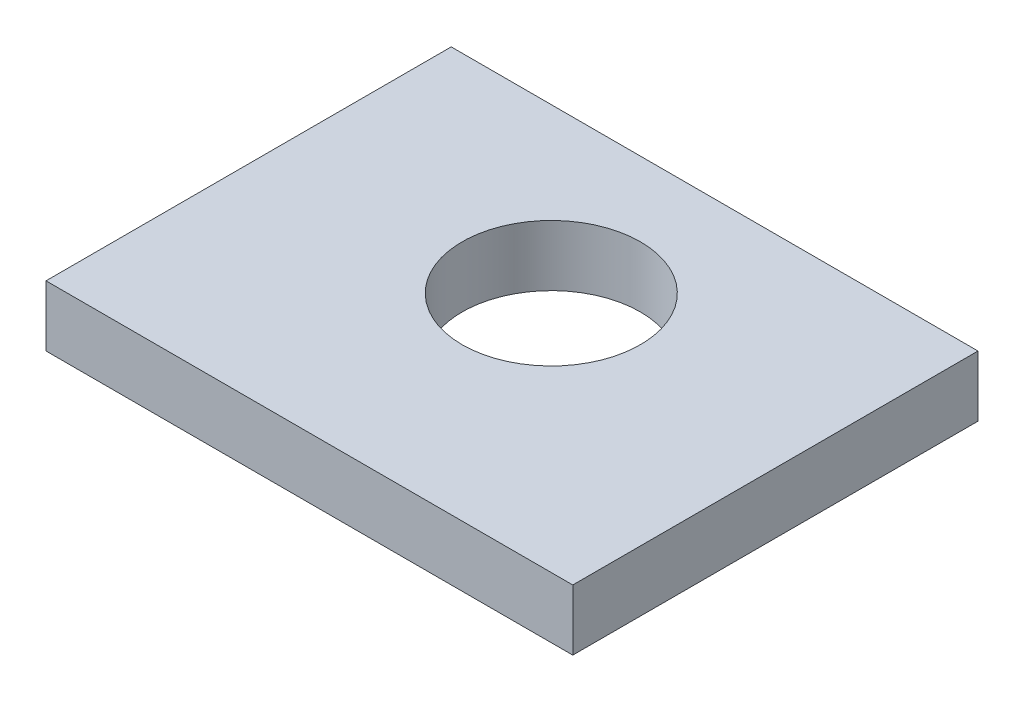
ISO-10303-21;
HEADER;
FILE_DESCRIPTION(('STEP AP214'),'2;1');
FILE_NAME('part.step','',(''),(''),'','','');
FILE_SCHEMA(('AUTOMOTIVE_DESIGN { 1 0 10303 214 1 1 1 1 }'));
ENDSEC;
DATA;
#1=APPLICATION_CONTEXT('core data for automotive mechanical design processes');
#2=APPLICATION_PROTOCOL_DEFINITION('international standard','automotive_design',2000,#1);
#3=PRODUCT_CONTEXT('',#1,'mechanical');
#4=PRODUCT('Part','Part','',(#3));
#5=PRODUCT_RELATED_PRODUCT_CATEGORY('part','',(#4));
#6=PRODUCT_DEFINITION_FORMATION('','',#4);
#7=PRODUCT_DEFINITION_CONTEXT('part definition',#1,'design');
#8=PRODUCT_DEFINITION('design','',#6,#7);
#9=PRODUCT_DEFINITION_SHAPE('','',#8);
#10=(LENGTH_UNIT() NAMED_UNIT(*) SI_UNIT(.MILLI.,.METRE.));
#11=(NAMED_UNIT(*) PLANE_ANGLE_UNIT() SI_UNIT($,.RADIAN.));
#12=(NAMED_UNIT(*) SI_UNIT($,.STERADIAN.) SOLID_ANGLE_UNIT());
#13=UNCERTAINTY_MEASURE_WITH_UNIT(LENGTH_MEASURE(1.E-05),#10,'distance_accuracy_value','');
#14=(GEOMETRIC_REPRESENTATION_CONTEXT(3) GLOBAL_UNCERTAINTY_ASSIGNED_CONTEXT((#13)) GLOBAL_UNIT_ASSIGNED_CONTEXT((#10,
#11,#12)) REPRESENTATION_CONTEXT('',''));
#15=CARTESIAN_POINT('',(0.,0.,0.));
#16=DIRECTION('',(0.,0.,1.));
#17=DIRECTION('',(1.,0.,0.));
#18=AXIS2_PLACEMENT_3D('',#15,#16,#17);
#19=CARTESIAN_POINT('',(3.25,0.75,2.5));
#20=DIRECTION('',(-1.,0.,0.));
#21=DIRECTION('',(0.,0.,1.));
#22=AXIS2_PLACEMENT_3D('',#19,#20,#21);
#23=PLANE('',#22);
#24=DIRECTION('',(0.,0.,-1.));
#25=VECTOR('',#24,1.);
#26=CARTESIAN_POINT('',(3.25,0.,2.5));
#27=LINE('',#26,#25);
#28=CARTESIAN_POINT('',(3.25,0.,2.5));
#29=VERTEX_POINT('',#28);
#30=CARTESIAN_POINT('',(3.25,0.,-2.5));
#31=VERTEX_POINT('',#30);
#32=EDGE_CURVE('E96',#29,#31,#27,.T.);
#33=ORIENTED_EDGE('',*,*,#32,.T.);
#34=DIRECTION('',(0.,-1.,0.));
#35=VECTOR('',#34,1.);
#36=CARTESIAN_POINT('',(3.25,0.75,-2.5));
#37=LINE('',#36,#35);
#38=CARTESIAN_POINT('',(3.25,0.75,-2.5));
#39=VERTEX_POINT('',#38);
#40=EDGE_CURVE('E11',#39,#31,#37,.T.);
#41=ORIENTED_EDGE('',*,*,#40,.F.);
#42=DIRECTION('',(0.,0.,-1.));
#43=VECTOR('',#42,1.);
#44=CARTESIAN_POINT('',(3.25,0.75,2.5));
#45=LINE('',#44,#43);
#46=CARTESIAN_POINT('',(3.25,0.75,2.5));
#47=VERTEX_POINT('',#46);
#48=EDGE_CURVE('E84',#47,#39,#45,.T.);
#49=ORIENTED_EDGE('',*,*,#48,.F.);
#50=DIRECTION('',(0.,-1.,0.));
#51=VECTOR('',#50,1.);
#52=CARTESIAN_POINT('',(3.25,0.75,2.5));
#53=LINE('',#52,#51);
#54=EDGE_CURVE('E92',#47,#29,#53,.T.);
#55=ORIENTED_EDGE('',*,*,#54,.T.);
#56=EDGE_LOOP('',(#33,#41,#49,#55));
#57=FACE_BOUND('',#56,.T.);
#58=ADVANCED_FACE('F33',(#57),#23,.F.);
#59=CARTESIAN_POINT('',(-3.25,0.75,-2.5));
#60=DIRECTION('',(0.,0.,1.));
#61=DIRECTION('',(1.,0.,0.));
#62=AXIS2_PLACEMENT_3D('',#59,#60,#61);
#63=PLANE('',#62);
#64=DIRECTION('',(-1.,0.,0.));
#65=VECTOR('',#64,1.);
#66=CARTESIAN_POINT('',(-3.25,0.,-2.5));
#67=LINE('',#66,#65);
#68=CARTESIAN_POINT('',(-3.25,0.,-2.5));
#69=VERTEX_POINT('',#68);
#70=EDGE_CURVE('E88',#31,#69,#67,.T.);
#71=ORIENTED_EDGE('',*,*,#70,.T.);
#72=DIRECTION('',(0.,-1.,0.));
#73=VECTOR('',#72,1.);
#74=CARTESIAN_POINT('',(-3.25,0.75,-2.5));
#75=LINE('',#74,#73);
#76=CARTESIAN_POINT('',(-3.25,0.75,-2.5));
#77=VERTEX_POINT('',#76);
#78=EDGE_CURVE('E41',#77,#69,#75,.T.);
#79=ORIENTED_EDGE('',*,*,#78,.F.);
#80=DIRECTION('',(-1.,0.,0.));
#81=VECTOR('',#80,1.);
#82=CARTESIAN_POINT('',(-3.25,0.75,-2.5));
#83=LINE('',#82,#81);
#84=EDGE_CURVE('E79',#39,#77,#83,.T.);
#85=ORIENTED_EDGE('',*,*,#84,.F.);
#86=ORIENTED_EDGE('',*,*,#40,.T.);
#87=EDGE_LOOP('',(#71,#79,#85,#86));
#88=FACE_BOUND('',#87,.T.);
#89=ADVANCED_FACE('F87',(#88),#63,.F.);
#90=CARTESIAN_POINT('',(-3.25,0.75,2.5));
#91=DIRECTION('',(1.,0.,0.));
#92=DIRECTION('',(0.,0.,-1.));
#93=AXIS2_PLACEMENT_3D('',#90,#91,#92);
#94=PLANE('',#93);
#95=DIRECTION('',(0.,0.,1.));
#96=VECTOR('',#95,1.);
#97=CARTESIAN_POINT('',(-3.25,0.,2.5));
#98=LINE('',#97,#96);
#99=CARTESIAN_POINT('',(-3.25,0.,2.5));
#100=VERTEX_POINT('',#99);
#101=EDGE_CURVE('E66',#69,#100,#98,.T.);
#102=ORIENTED_EDGE('',*,*,#101,.T.);
#103=DIRECTION('',(0.,-1.,0.));
#104=VECTOR('',#103,1.);
#105=CARTESIAN_POINT('',(-3.25,0.75,2.5));
#106=LINE('',#105,#104);
#107=CARTESIAN_POINT('',(-3.25,0.75,2.5));
#108=VERTEX_POINT('',#107);
#109=EDGE_CURVE('E89',#108,#100,#106,.T.);
#110=ORIENTED_EDGE('',*,*,#109,.F.);
#111=DIRECTION('',(0.,0.,1.));
#112=VECTOR('',#111,1.);
#113=CARTESIAN_POINT('',(-3.25,0.75,2.5));
#114=LINE('',#113,#112);
#115=EDGE_CURVE('E82',#77,#108,#114,.T.);
#116=ORIENTED_EDGE('',*,*,#115,.F.);
#117=ORIENTED_EDGE('',*,*,#78,.T.);
#118=EDGE_LOOP('',(#102,#110,#116,#117));
#119=FACE_BOUND('',#118,.T.);
#120=ADVANCED_FACE('F90',(#119),#94,.F.);
#121=CARTESIAN_POINT('',(-3.25,0.75,2.5));
#122=DIRECTION('',(0.,0.,-1.));
#123=DIRECTION('',(-1.,0.,0.));
#124=AXIS2_PLACEMENT_3D('',#121,#122,#123);
#125=PLANE('',#124);
#126=DIRECTION('',(1.,0.,0.));
#127=VECTOR('',#126,1.);
#128=CARTESIAN_POINT('',(-3.25,0.,2.5));
#129=LINE('',#128,#127);
#130=EDGE_CURVE('E72',#100,#29,#129,.T.);
#131=ORIENTED_EDGE('',*,*,#130,.T.);
#132=ORIENTED_EDGE('',*,*,#54,.F.);
#133=DIRECTION('',(1.,0.,0.));
#134=VECTOR('',#133,1.);
#135=CARTESIAN_POINT('',(-3.25,0.75,2.5));
#136=LINE('',#135,#134);
#137=EDGE_CURVE('E49',#108,#47,#136,.T.);
#138=ORIENTED_EDGE('',*,*,#137,.F.);
#139=ORIENTED_EDGE('',*,*,#109,.T.);
#140=EDGE_LOOP('',(#131,#132,#138,#139));
#141=FACE_BOUND('',#140,.T.);
#142=ADVANCED_FACE('F104',(#141),#125,.F.);
#143=CARTESIAN_POINT('',(0.,0.75,0.));
#144=DIRECTION('',(0.,-1.,0.));
#145=DIRECTION('',(0.,0.,-1.));
#146=AXIS2_PLACEMENT_3D('',#143,#144,#145);
#147=PLANE('',#146);
#148=CARTESIAN_POINT('',(1.33365540833097E-11,0.75,-0.484711092399059));
#149=DIRECTION('',(0.,1.,0.));
#150=DIRECTION('',(0.,0.,1.));
#151=AXIS2_PLACEMENT_3D('',#148,#149,#150);
#152=CIRCLE('',#151,1.1);
#153=CARTESIAN_POINT('',(1.33365540833097E-11,0.75,0.615288907600941));
#154=VERTEX_POINT('',#153);
#155=EDGE_CURVE('E99',#154,#154,#152,.T.);
#156=ORIENTED_EDGE('',*,*,#155,.F.);
#157=EDGE_LOOP('',(#156));
#158=FACE_BOUND('',#157,.T.);
#159=ORIENTED_EDGE('',*,*,#48,.T.);
#160=ORIENTED_EDGE('',*,*,#84,.T.);
#161=ORIENTED_EDGE('',*,*,#115,.T.);
#162=ORIENTED_EDGE('',*,*,#137,.T.);
#163=EDGE_LOOP('',(#159,#160,#161,#162));
#164=FACE_BOUND('',#163,.T.);
#165=ADVANCED_FACE('F80',(#158,#164),#147,.F.);
#166=CARTESIAN_POINT('',(0.,0.,0.));
#167=DIRECTION('',(0.,-1.,0.));
#168=DIRECTION('',(0.,0.,-1.));
#169=AXIS2_PLACEMENT_3D('',#166,#167,#168);
#170=PLANE('',#169);
#171=CARTESIAN_POINT('',(1.33365540833097E-11,0.,-0.484711092399059));
#172=DIRECTION('',(0.,1.,0.));
#173=DIRECTION('',(0.,0.,1.));
#174=AXIS2_PLACEMENT_3D('',#171,#172,#173);
#175=CIRCLE('',#174,1.1);
#176=CARTESIAN_POINT('',(1.33365540833097E-11,0.,0.615288907600941));
#177=VERTEX_POINT('',#176);
#178=EDGE_CURVE('E110',#177,#177,#175,.T.);
#179=ORIENTED_EDGE('',*,*,#178,.T.);
#180=EDGE_LOOP('',(#179));
#181=FACE_BOUND('',#180,.T.);
#182=ORIENTED_EDGE('',*,*,#32,.F.);
#183=ORIENTED_EDGE('',*,*,#130,.F.);
#184=ORIENTED_EDGE('',*,*,#101,.F.);
#185=ORIENTED_EDGE('',*,*,#70,.F.);
#186=EDGE_LOOP('',(#182,#183,#184,#185));
#187=FACE_BOUND('',#186,.T.);
#188=ADVANCED_FACE('F107',(#181,#187),#170,.T.);
#189=CARTESIAN_POINT('',(1.33365540833097E-11,0.75,-0.484711092399059));
#190=DIRECTION('',(0.,-1.,0.));
#191=DIRECTION('',(0.,0.,-1.));
#192=AXIS2_PLACEMENT_3D('',#189,#190,#191);
#193=CYLINDRICAL_SURFACE('',#192,1.1);
#194=ORIENTED_EDGE('',*,*,#155,.T.);
#195=EDGE_LOOP('',(#194));
#196=FACE_BOUND('',#195,.T.);
#197=ORIENTED_EDGE('',*,*,#178,.F.);
#198=EDGE_LOOP('',(#197));
#199=FACE_BOUND('',#198,.T.);
#200=ADVANCED_FACE('F116',(#196,#199),#193,.F.);
#201=CLOSED_SHELL('',(#58,#89,#120,#142,#165,#188,#200));
#202=MANIFOLD_SOLID_BREP('B2',#201);
#203=ADVANCED_BREP_SHAPE_REPRESENTATION('',(#18,#202),#14);
#204=SHAPE_DEFINITION_REPRESENTATION(#9,#203);
ENDSEC;
END-ISO-10303-21;
